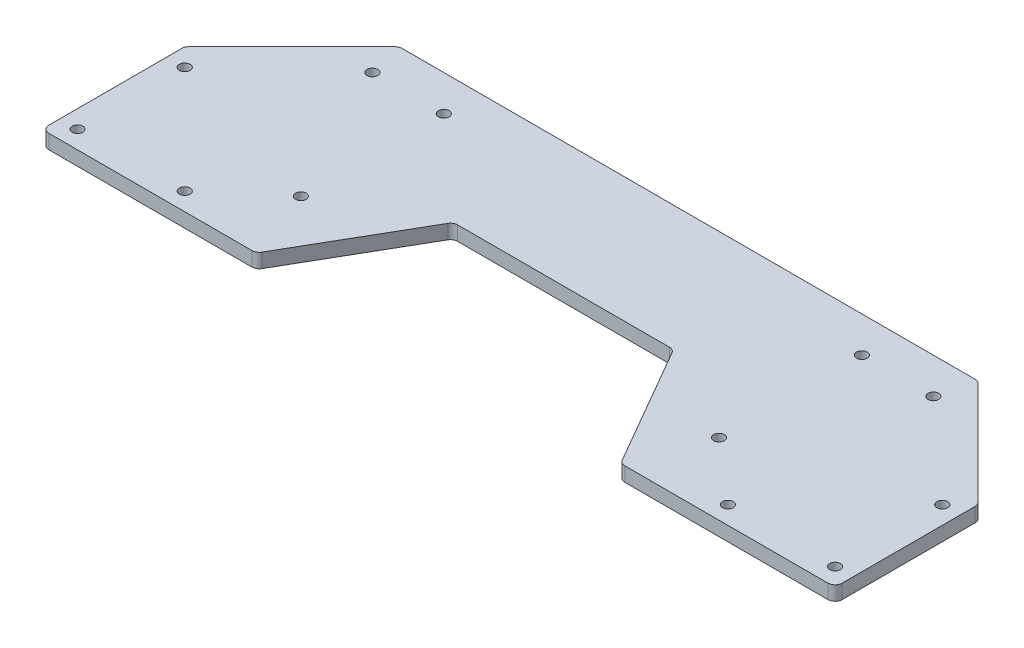
ISO-10303-21;
HEADER;
FILE_DESCRIPTION(('STEP AP214'),'2;1');
FILE_NAME('part.step','',(''),(''),'','','');
FILE_SCHEMA(('AUTOMOTIVE_DESIGN { 1 0 10303 214 1 1 1 1 }'));
ENDSEC;
DATA;
#1=APPLICATION_CONTEXT('core data for automotive mechanical design processes');
#2=APPLICATION_PROTOCOL_DEFINITION('international standard','automotive_design',2000,#1);
#3=PRODUCT_CONTEXT('',#1,'mechanical');
#4=PRODUCT('Part','Part','',(#3));
#5=PRODUCT_RELATED_PRODUCT_CATEGORY('part','',(#4));
#6=PRODUCT_DEFINITION_FORMATION('','',#4);
#7=PRODUCT_DEFINITION_CONTEXT('part definition',#1,'design');
#8=PRODUCT_DEFINITION('design','',#6,#7);
#9=PRODUCT_DEFINITION_SHAPE('','',#8);
#10=(LENGTH_UNIT() NAMED_UNIT(*) SI_UNIT(.MILLI.,.METRE.));
#11=(NAMED_UNIT(*) PLANE_ANGLE_UNIT() SI_UNIT($,.RADIAN.));
#12=(NAMED_UNIT(*) SI_UNIT($,.STERADIAN.) SOLID_ANGLE_UNIT());
#13=UNCERTAINTY_MEASURE_WITH_UNIT(LENGTH_MEASURE(1.E-05),#10,'distance_accuracy_value','');
#14=(GEOMETRIC_REPRESENTATION_CONTEXT(3) GLOBAL_UNCERTAINTY_ASSIGNED_CONTEXT((#13)) GLOBAL_UNIT_ASSIGNED_CONTEXT((#10,
#11,#12)) REPRESENTATION_CONTEXT('',''));
#15=CARTESIAN_POINT('',(0.,0.,0.));
#16=DIRECTION('',(0.,0.,1.));
#17=DIRECTION('',(1.,0.,0.));
#18=AXIS2_PLACEMENT_3D('',#15,#16,#17);
#19=CARTESIAN_POINT('',(-50.2072594216367,4.,-35.));
#20=DIRECTION('',(0.707106781186547,0.,0.707106781186549));
#21=DIRECTION('',(0.707106781186549,0.,-0.707106781186547));
#22=AXIS2_PLACEMENT_3D('',#19,#20,#21);
#23=PLANE('',#22);
#24=DIRECTION('',(-0.707106781186549,0.,0.707106781186547));
#25=VECTOR('',#24,1.);
#26=CARTESIAN_POINT('',(-50.2072594216367,4.,-35.));
#27=LINE('',#26,#25);
#28=CARTESIAN_POINT('',(-50.7930458592636,4.,-34.4142135623731));
#29=VERTEX_POINT('',#28);
#30=CARTESIAN_POINT('',(-79.6214729840099,4.,-5.58578643762689));
#31=VERTEX_POINT('',#30);
#32=EDGE_CURVE('E220',#29,#31,#27,.T.);
#33=ORIENTED_EDGE('',*,*,#32,.F.);
#34=DIRECTION('',(0.,-1.,0.));
#35=VECTOR('',#34,1.);
#36=CARTESIAN_POINT('',(-50.7930458592636,4.,-34.4142135623731));
#37=LINE('',#36,#35);
#38=CARTESIAN_POINT('',(-50.7930458592636,0.,-34.4142135623731));
#39=VERTEX_POINT('',#38);
#40=EDGE_CURVE('E322',#29,#39,#37,.T.);
#41=ORIENTED_EDGE('',*,*,#40,.T.);
#42=DIRECTION('',(-0.707106781186549,0.,0.707106781186547));
#43=VECTOR('',#42,1.);
#44=CARTESIAN_POINT('',(-50.2072594216367,0.,-35.));
#45=LINE('',#44,#43);
#46=CARTESIAN_POINT('',(-79.6214729840099,0.,-5.58578643762689));
#47=VERTEX_POINT('',#46);
#48=EDGE_CURVE('E224',#39,#47,#45,.T.);
#49=ORIENTED_EDGE('',*,*,#48,.T.);
#50=DIRECTION('',(0.,-1.,0.));
#51=VECTOR('',#50,1.);
#52=CARTESIAN_POINT('',(-79.6214729840099,4.,-5.58578643762689));
#53=LINE('',#52,#51);
#54=EDGE_CURVE('E320',#47,#31,#53,.F.);
#55=ORIENTED_EDGE('',*,*,#54,.T.);
#56=EDGE_LOOP('',(#33,#41,#49,#55));
#57=FACE_BOUND('',#56,.T.);
#58=ADVANCED_FACE('F35',(#57),#23,.F.);
#59=CARTESIAN_POINT('',(-80.2072594216368,4.,-4.99999999999998));
#60=DIRECTION('',(1.,0.,0.));
#61=DIRECTION('',(0.,0.,-1.));
#62=AXIS2_PLACEMENT_3D('',#59,#60,#61);
#63=PLANE('',#62);
#64=DIRECTION('',(0.,0.,1.));
#65=VECTOR('',#64,1.);
#66=CARTESIAN_POINT('',(-80.2072594216368,4.,-4.99999999999998));
#67=LINE('',#66,#65);
#68=CARTESIAN_POINT('',(-80.2072594216368,4.,-4.1715728752538));
#69=VERTEX_POINT('',#68);
#70=CARTESIAN_POINT('',(-80.2072594216368,4.,33.));
#71=VERTEX_POINT('',#70);
#72=EDGE_CURVE('E348',#69,#71,#67,.T.);
#73=ORIENTED_EDGE('',*,*,#72,.F.);
#74=DIRECTION('',(0.,-1.,0.));
#75=VECTOR('',#74,1.);
#76=CARTESIAN_POINT('',(-80.2072594216368,4.,-4.1715728752538));
#77=LINE('',#76,#75);
#78=CARTESIAN_POINT('',(-80.2072594216368,0.,-4.1715728752538));
#79=VERTEX_POINT('',#78);
#80=EDGE_CURVE('E327',#69,#79,#77,.T.);
#81=ORIENTED_EDGE('',*,*,#80,.T.);
#82=DIRECTION('',(0.,0.,1.));
#83=VECTOR('',#82,1.);
#84=CARTESIAN_POINT('',(-80.2072594216368,0.,-4.99999999999998));
#85=LINE('',#84,#83);
#86=CARTESIAN_POINT('',(-80.2072594216368,0.,33.));
#87=VERTEX_POINT('',#86);
#88=EDGE_CURVE('E364',#79,#87,#85,.T.);
#89=ORIENTED_EDGE('',*,*,#88,.T.);
#90=DIRECTION('',(0.,-1.,0.));
#91=VECTOR('',#90,1.);
#92=CARTESIAN_POINT('',(-80.2072594216368,4.,33.));
#93=LINE('',#92,#91);
#94=EDGE_CURVE('E325',#87,#71,#93,.F.);
#95=ORIENTED_EDGE('',*,*,#94,.T.);
#96=EDGE_LOOP('',(#73,#81,#89,#95));
#97=FACE_BOUND('',#96,.T.);
#98=ADVANCED_FACE('F383',(#97),#63,.F.);
#99=CARTESIAN_POINT('',(-80.2072594216368,4.,35.));
#100=DIRECTION('',(0.,0.,-1.));
#101=DIRECTION('',(-1.,0.,0.));
#102=AXIS2_PLACEMENT_3D('',#99,#100,#101);
#103=PLANE('',#102);
#104=DIRECTION('',(1.,0.,0.));
#105=VECTOR('',#104,1.);
#106=CARTESIAN_POINT('',(-80.2072594216368,4.,35.));
#107=LINE('',#106,#105);
#108=CARTESIAN_POINT('',(-78.2072594216368,4.,35.));
#109=VERTEX_POINT('',#108);
#110=CARTESIAN_POINT('',(-21.361959960016,4.,35.));
#111=VERTEX_POINT('',#110);
#112=EDGE_CURVE('E344',#109,#111,#107,.T.);
#113=ORIENTED_EDGE('',*,*,#112,.F.);
#114=DIRECTION('',(0.,-1.,0.));
#115=VECTOR('',#114,1.);
#116=CARTESIAN_POINT('',(-78.2072594216368,4.,35.));
#117=LINE('',#116,#115);
#118=CARTESIAN_POINT('',(-78.2072594216368,0.,35.));
#119=VERTEX_POINT('',#118);
#120=EDGE_CURVE('E184',#109,#119,#117,.T.);
#121=ORIENTED_EDGE('',*,*,#120,.T.);
#122=DIRECTION('',(1.,0.,0.));
#123=VECTOR('',#122,1.);
#124=CARTESIAN_POINT('',(-80.2072594216368,0.,35.));
#125=LINE('',#124,#123);
#126=CARTESIAN_POINT('',(-21.361959960016,0.,35.));
#127=VERTEX_POINT('',#126);
#128=EDGE_CURVE('E206',#119,#127,#125,.T.);
#129=ORIENTED_EDGE('',*,*,#128,.T.);
#130=DIRECTION('',(0.,-1.,0.));
#131=VECTOR('',#130,1.);
#132=CARTESIAN_POINT('',(-21.361959960016,4.,35.));
#133=LINE('',#132,#131);
#134=EDGE_CURVE('E330',#127,#111,#133,.F.);
#135=ORIENTED_EDGE('',*,*,#134,.T.);
#136=EDGE_LOOP('',(#113,#121,#129,#135));
#137=FACE_BOUND('',#136,.T.);
#138=ADVANCED_FACE('F371',(#137),#103,.F.);
#139=CARTESIAN_POINT('',(-20.2072594216368,4.,35.));
#140=DIRECTION('',(-0.86602540378444,0.,-0.499999999999998));
#141=DIRECTION('',(-0.499999999999998,0.,0.86602540378444));
#142=AXIS2_PLACEMENT_3D('',#139,#140,#141);
#143=PLANE('',#142);
#144=DIRECTION('',(0.499999999999998,0.,-0.86602540378444));
#145=VECTOR('',#144,1.);
#146=CARTESIAN_POINT('',(-20.2072594216368,0.,35.));
#147=LINE('',#146,#145);
#148=CARTESIAN_POINT('',(-19.6299091524472,0.,34.));
#149=VERTEX_POINT('',#148);
#150=CARTESIAN_POINT('',(-0.57735026918963,0.,1.00000000000001));
#151=VERTEX_POINT('',#150);
#152=EDGE_CURVE('E201',#149,#151,#147,.T.);
#153=ORIENTED_EDGE('',*,*,#152,.T.);
#154=DIRECTION('',(0.,-1.,0.));
#155=VECTOR('',#154,1.);
#156=CARTESIAN_POINT('',(-0.577350269189628,4.,1.00000000000001));
#157=LINE('',#156,#155);
#158=CARTESIAN_POINT('',(-0.57735026918963,4.,1.00000000000001));
#159=VERTEX_POINT('',#158);
#160=EDGE_CURVE('E178',#151,#159,#157,.F.);
#161=ORIENTED_EDGE('',*,*,#160,.T.);
#162=DIRECTION('',(0.499999999999998,0.,-0.86602540378444));
#163=VECTOR('',#162,1.);
#164=CARTESIAN_POINT('',(-20.2072594216368,4.,35.));
#165=LINE('',#164,#163);
#166=CARTESIAN_POINT('',(-19.6299091524472,4.,34.));
#167=VERTEX_POINT('',#166);
#168=EDGE_CURVE('E339',#167,#159,#165,.T.);
#169=ORIENTED_EDGE('',*,*,#168,.F.);
#170=DIRECTION('',(0.,-1.,0.));
#171=VECTOR('',#170,1.);
#172=CARTESIAN_POINT('',(-19.6299091524472,4.,34.));
#173=LINE('',#172,#171);
#174=EDGE_CURVE('E194',#167,#149,#173,.T.);
#175=ORIENTED_EDGE('',*,*,#174,.T.);
#176=EDGE_LOOP('',(#153,#161,#169,#175));
#177=FACE_BOUND('',#176,.T.);
#178=ADVANCED_FACE('F374',(#177),#143,.F.);
#179=CARTESIAN_POINT('',(0.,4.,0.));
#180=DIRECTION('',(0.,0.,-1.));
#181=DIRECTION('',(-1.,0.,0.));
#182=AXIS2_PLACEMENT_3D('',#179,#180,#181);
#183=PLANE('',#182);
#184=DIRECTION('',(1.,0.,0.));
#185=VECTOR('',#184,1.);
#186=CARTESIAN_POINT('',(0.,4.,0.));
#187=LINE('',#186,#185);
#188=CARTESIAN_POINT('',(1.15470053837925,4.,0.));
#189=VERTEX_POINT('',#188);
#190=CARTESIAN_POINT('',(60.4307806183472,4.,0.));
#191=VERTEX_POINT('',#190);
#192=EDGE_CURVE('E193',#189,#191,#187,.T.);
#193=ORIENTED_EDGE('',*,*,#192,.F.);
#194=DIRECTION('',(0.,-1.,0.));
#195=VECTOR('',#194,1.);
#196=CARTESIAN_POINT('',(1.15470053837925,0.,0.));
#197=LINE('',#196,#195);
#198=CARTESIAN_POINT('',(1.15470053837925,0.,0.));
#199=VERTEX_POINT('',#198);
#200=EDGE_CURVE('E177',#189,#199,#197,.T.);
#201=ORIENTED_EDGE('',*,*,#200,.T.);
#202=DIRECTION('',(1.,0.,0.));
#203=VECTOR('',#202,1.);
#204=CARTESIAN_POINT('',(0.,0.,0.));
#205=LINE('',#204,#203);
#206=CARTESIAN_POINT('',(60.4307806183472,0.,0.));
#207=VERTEX_POINT('',#206);
#208=EDGE_CURVE('E190',#199,#207,#205,.T.);
#209=ORIENTED_EDGE('',*,*,#208,.T.);
#210=DIRECTION('',(0.,-1.,0.));
#211=VECTOR('',#210,1.);
#212=CARTESIAN_POINT('',(60.4307806183472,4.,0.));
#213=LINE('',#212,#211);
#214=EDGE_CURVE('E195',#207,#191,#213,.F.);
#215=ORIENTED_EDGE('',*,*,#214,.T.);
#216=EDGE_LOOP('',(#193,#201,#209,#215));
#217=FACE_BOUND('',#216,.T.);
#218=ADVANCED_FACE('F189',(#217),#183,.F.);
#219=CARTESIAN_POINT('',(61.5854811567264,4.,0.));
#220=DIRECTION('',(0.86602540378444,0.,-0.499999999999998));
#221=DIRECTION('',(-0.499999999999998,0.,-0.86602540378444));
#222=AXIS2_PLACEMENT_3D('',#219,#220,#221);
#223=PLANE('',#222);
#224=DIRECTION('',(0.499999999999998,0.,0.86602540378444));
#225=VECTOR('',#224,1.);
#226=CARTESIAN_POINT('',(61.5854811567264,4.,0.));
#227=LINE('',#226,#225);
#228=CARTESIAN_POINT('',(62.162831425916,4.,1.00000000000001));
#229=VERTEX_POINT('',#228);
#230=CARTESIAN_POINT('',(81.2153903091736,4.,34.));
#231=VERTEX_POINT('',#230);
#232=EDGE_CURVE('E346',#229,#231,#227,.T.);
#233=ORIENTED_EDGE('',*,*,#232,.F.);
#234=DIRECTION('',(0.,-1.,0.));
#235=VECTOR('',#234,1.);
#236=CARTESIAN_POINT('',(62.162831425916,0.,1.00000000000001));
#237=LINE('',#236,#235);
#238=CARTESIAN_POINT('',(62.162831425916,0.,1.00000000000001));
#239=VERTEX_POINT('',#238);
#240=EDGE_CURVE('E267',#229,#239,#237,.T.);
#241=ORIENTED_EDGE('',*,*,#240,.T.);
#242=DIRECTION('',(0.499999999999998,0.,0.86602540378444));
#243=VECTOR('',#242,1.);
#244=CARTESIAN_POINT('',(61.5854811567264,0.,0.));
#245=LINE('',#244,#243);
#246=CARTESIAN_POINT('',(81.2153903091736,0.,34.));
#247=VERTEX_POINT('',#246);
#248=EDGE_CURVE('E200',#239,#247,#245,.T.);
#249=ORIENTED_EDGE('',*,*,#248,.T.);
#250=DIRECTION('',(0.,-1.,0.));
#251=VECTOR('',#250,1.);
#252=CARTESIAN_POINT('',(81.2153903091736,4.,34.));
#253=LINE('',#252,#251);
#254=EDGE_CURVE('E265',#247,#231,#253,.F.);
#255=ORIENTED_EDGE('',*,*,#254,.T.);
#256=EDGE_LOOP('',(#233,#241,#249,#255));
#257=FACE_BOUND('',#256,.T.);
#258=ADVANCED_FACE('F381',(#257),#223,.F.);
#259=CARTESIAN_POINT('',(81.7927405783632,4.,35.));
#260=DIRECTION('',(0.,0.,-1.));
#261=DIRECTION('',(-1.,0.,0.));
#262=AXIS2_PLACEMENT_3D('',#259,#260,#261);
#263=PLANE('',#262);
#264=DIRECTION('',(1.,0.,0.));
#265=VECTOR('',#264,1.);
#266=CARTESIAN_POINT('',(81.7927405783632,4.,35.));
#267=LINE('',#266,#265);
#268=CARTESIAN_POINT('',(82.9474411167425,4.,35.));
#269=VERTEX_POINT('',#268);
#270=CARTESIAN_POINT('',(139.792740578363,4.,35.));
#271=VERTEX_POINT('',#270);
#272=EDGE_CURVE('E353',#269,#271,#267,.T.);
#273=ORIENTED_EDGE('',*,*,#272,.F.);
#274=DIRECTION('',(0.,-1.,0.));
#275=VECTOR('',#274,1.);
#276=CARTESIAN_POINT('',(82.9474411167425,4.,35.));
#277=LINE('',#276,#275);
#278=CARTESIAN_POINT('',(82.9474411167425,0.,35.));
#279=VERTEX_POINT('',#278);
#280=EDGE_CURVE('E272',#269,#279,#277,.T.);
#281=ORIENTED_EDGE('',*,*,#280,.T.);
#282=DIRECTION('',(1.,0.,0.));
#283=VECTOR('',#282,1.);
#284=CARTESIAN_POINT('',(81.7927405783632,0.,35.));
#285=LINE('',#284,#283);
#286=CARTESIAN_POINT('',(139.792740578363,0.,35.));
#287=VERTEX_POINT('',#286);
#288=EDGE_CURVE('E204',#279,#287,#285,.T.);
#289=ORIENTED_EDGE('',*,*,#288,.T.);
#290=DIRECTION('',(0.,-1.,0.));
#291=VECTOR('',#290,1.);
#292=CARTESIAN_POINT('',(139.792740578363,4.,35.));
#293=LINE('',#292,#291);
#294=EDGE_CURVE('E270',#287,#271,#293,.F.);
#295=ORIENTED_EDGE('',*,*,#294,.T.);
#296=EDGE_LOOP('',(#273,#281,#289,#295));
#297=FACE_BOUND('',#296,.T.);
#298=ADVANCED_FACE('F527',(#297),#263,.F.);
#299=CARTESIAN_POINT('',(141.792740578363,4.,35.));
#300=DIRECTION('',(-1.,0.,0.));
#301=DIRECTION('',(0.,0.,1.));
#302=AXIS2_PLACEMENT_3D('',#299,#300,#301);
#303=PLANE('',#302);
#304=DIRECTION('',(0.,0.,-1.));
#305=VECTOR('',#304,1.);
#306=CARTESIAN_POINT('',(141.792740578363,4.,35.));
#307=LINE('',#306,#305);
#308=CARTESIAN_POINT('',(141.792740578363,4.,33.));
#309=VERTEX_POINT('',#308);
#310=CARTESIAN_POINT('',(141.792740578363,4.,-4.17157287525382));
#311=VERTEX_POINT('',#310);
#312=EDGE_CURVE('E356',#309,#311,#307,.T.);
#313=ORIENTED_EDGE('',*,*,#312,.F.);
#314=DIRECTION('',(0.,-1.,0.));
#315=VECTOR('',#314,1.);
#316=CARTESIAN_POINT('',(141.792740578363,4.,33.));
#317=LINE('',#316,#315);
#318=CARTESIAN_POINT('',(141.792740578363,0.,33.));
#319=VERTEX_POINT('',#318);
#320=EDGE_CURVE('E308',#309,#319,#317,.T.);
#321=ORIENTED_EDGE('',*,*,#320,.T.);
#322=DIRECTION('',(0.,0.,-1.));
#323=VECTOR('',#322,1.);
#324=CARTESIAN_POINT('',(141.792740578363,0.,35.));
#325=LINE('',#324,#323);
#326=CARTESIAN_POINT('',(141.792740578363,0.,-4.17157287525382));
#327=VERTEX_POINT('',#326);
#328=EDGE_CURVE('E212',#319,#327,#325,.T.);
#329=ORIENTED_EDGE('',*,*,#328,.T.);
#330=DIRECTION('',(0.,-1.,0.));
#331=VECTOR('',#330,1.);
#332=CARTESIAN_POINT('',(141.792740578363,4.,-4.17157287525382));
#333=LINE('',#332,#331);
#334=EDGE_CURVE('E306',#327,#311,#333,.F.);
#335=ORIENTED_EDGE('',*,*,#334,.T.);
#336=EDGE_LOOP('',(#313,#321,#329,#335));
#337=FACE_BOUND('',#336,.T.);
#338=ADVANCED_FACE('F523',(#337),#303,.F.);
#339=CARTESIAN_POINT('',(141.792740578363,4.,-5.00000000000001));
#340=DIRECTION('',(-0.707106781186546,0.,0.707106781186549));
#341=DIRECTION('',(0.707106781186549,0.,0.707106781186546));
#342=AXIS2_PLACEMENT_3D('',#339,#340,#341);
#343=PLANE('',#342);
#344=DIRECTION('',(-0.707106781186549,0.,-0.707106781186546));
#345=VECTOR('',#344,1.);
#346=CARTESIAN_POINT('',(141.792740578363,4.,-5.00000000000001));
#347=LINE('',#346,#345);
#348=CARTESIAN_POINT('',(141.206954140736,4.,-5.58578643762692));
#349=VERTEX_POINT('',#348);
#350=CARTESIAN_POINT('',(112.37852701599,4.,-34.4142135623731));
#351=VERTEX_POINT('',#350);
#352=EDGE_CURVE('E359',#349,#351,#347,.T.);
#353=ORIENTED_EDGE('',*,*,#352,.F.);
#354=DIRECTION('',(0.,-1.,0.));
#355=VECTOR('',#354,1.);
#356=CARTESIAN_POINT('',(141.206954140736,4.,-5.58578643762692));
#357=LINE('',#356,#355);
#358=CARTESIAN_POINT('',(141.206954140736,0.,-5.58578643762692));
#359=VERTEX_POINT('',#358);
#360=EDGE_CURVE('E313',#349,#359,#357,.T.);
#361=ORIENTED_EDGE('',*,*,#360,.T.);
#362=DIRECTION('',(-0.707106781186549,0.,-0.707106781186546));
#363=VECTOR('',#362,1.);
#364=CARTESIAN_POINT('',(141.792740578363,0.,-5.00000000000001));
#365=LINE('',#364,#363);
#366=CARTESIAN_POINT('',(112.37852701599,0.,-34.4142135623731));
#367=VERTEX_POINT('',#366);
#368=EDGE_CURVE('E215',#359,#367,#365,.T.);
#369=ORIENTED_EDGE('',*,*,#368,.T.);
#370=DIRECTION('',(0.,-1.,0.));
#371=VECTOR('',#370,1.);
#372=CARTESIAN_POINT('',(112.37852701599,4.,-34.4142135623731));
#373=LINE('',#372,#371);
#374=EDGE_CURVE('E311',#367,#351,#373,.F.);
#375=ORIENTED_EDGE('',*,*,#374,.T.);
#376=EDGE_LOOP('',(#353,#361,#369,#375));
#377=FACE_BOUND('',#376,.T.);
#378=ADVANCED_FACE('F520',(#377),#343,.F.);
#379=CARTESIAN_POINT('',(111.792740578363,4.,-35.));
#380=DIRECTION('',(0.,0.,1.));
#381=DIRECTION('',(1.,0.,0.));
#382=AXIS2_PLACEMENT_3D('',#379,#380,#381);
#383=PLANE('',#382);
#384=DIRECTION('',(-1.,0.,0.));
#385=VECTOR('',#384,1.);
#386=CARTESIAN_POINT('',(111.792740578363,4.,-35.));
#387=LINE('',#386,#385);
#388=CARTESIAN_POINT('',(110.964313453617,4.,-35.));
#389=VERTEX_POINT('',#388);
#390=CARTESIAN_POINT('',(-49.3788322968905,4.,-35.));
#391=VERTEX_POINT('',#390);
#392=EDGE_CURVE('E260',#389,#391,#387,.T.);
#393=ORIENTED_EDGE('',*,*,#392,.F.);
#394=DIRECTION('',(0.,-1.,0.));
#395=VECTOR('',#394,1.);
#396=CARTESIAN_POINT('',(110.964313453617,4.,-35.));
#397=LINE('',#396,#395);
#398=CARTESIAN_POINT('',(110.964313453617,0.,-35.));
#399=VERTEX_POINT('',#398);
#400=EDGE_CURVE('E317',#389,#399,#397,.T.);
#401=ORIENTED_EDGE('',*,*,#400,.T.);
#402=DIRECTION('',(-1.,0.,0.));
#403=VECTOR('',#402,1.);
#404=CARTESIAN_POINT('',(111.792740578363,0.,-35.));
#405=LINE('',#404,#403);
#406=CARTESIAN_POINT('',(-49.3788322968905,0.,-35.));
#407=VERTEX_POINT('',#406);
#408=EDGE_CURVE('E218',#399,#407,#405,.T.);
#409=ORIENTED_EDGE('',*,*,#408,.T.);
#410=DIRECTION('',(0.,-1.,0.));
#411=VECTOR('',#410,1.);
#412=CARTESIAN_POINT('',(-49.3788322968905,4.,-35.));
#413=LINE('',#412,#411);
#414=EDGE_CURVE('E50',#407,#391,#413,.F.);
#415=ORIENTED_EDGE('',*,*,#414,.T.);
#416=EDGE_LOOP('',(#393,#401,#409,#415));
#417=FACE_BOUND('',#416,.T.);
#418=ADVANCED_FACE('F479',(#417),#383,.F.);
#419=CARTESIAN_POINT('',(0.,4.,0.));
#420=DIRECTION('',(0.,-1.,0.));
#421=DIRECTION('',(0.,0.,-1.));
#422=AXIS2_PLACEMENT_3D('',#419,#420,#421);
#423=PLANE('',#422);
#424=CARTESIAN_POINT('',(-47.7072594216368,4.,-25.));
#425=DIRECTION('',(0.,1.,0.));
#426=DIRECTION('',(0.,0.,1.));
#427=AXIS2_PLACEMENT_3D('',#424,#425,#426);
#428=CIRCLE('',#427,1.5);
#429=CARTESIAN_POINT('',(-47.7072594216368,4.,-23.5));
#430=VERTEX_POINT('',#429);
#431=EDGE_CURVE('E452',#430,#430,#428,.T.);
#432=ORIENTED_EDGE('',*,*,#431,.F.);
#433=EDGE_LOOP('',(#432));
#434=FACE_BOUND('',#433,.T.);
#435=CARTESIAN_POINT('',(-75.2072594216368,4.,0.));
#436=DIRECTION('',(0.,1.,0.));
#437=DIRECTION('',(0.,0.,1.));
#438=AXIS2_PLACEMENT_3D('',#435,#436,#437);
#439=CIRCLE('',#438,1.5);
#440=CARTESIAN_POINT('',(-75.2072594216368,4.,1.5));
#441=VERTEX_POINT('',#440);
#442=EDGE_CURVE('E469',#441,#441,#439,.T.);
#443=ORIENTED_EDGE('',*,*,#442,.F.);
#444=EDGE_LOOP('',(#443));
#445=FACE_BOUND('',#444,.T.);
#446=CARTESIAN_POINT('',(-45.2072594216368,4.,30.));
#447=DIRECTION('',(0.,1.,0.));
#448=DIRECTION('',(0.,0.,1.));
#449=AXIS2_PLACEMENT_3D('',#446,#447,#448);
#450=CIRCLE('',#449,1.5);
#451=CARTESIAN_POINT('',(-45.2072594216368,4.,31.5));
#452=VERTEX_POINT('',#451);
#453=EDGE_CURVE('E464',#452,#452,#450,.T.);
#454=ORIENTED_EDGE('',*,*,#453,.F.);
#455=EDGE_LOOP('',(#454));
#456=FACE_BOUND('',#455,.T.);
#457=CARTESIAN_POINT('',(-75.2072594216368,4.,30.));
#458=DIRECTION('',(0.,1.,0.));
#459=DIRECTION('',(0.,0.,1.));
#460=AXIS2_PLACEMENT_3D('',#457,#458,#459);
#461=CIRCLE('',#460,1.5);
#462=CARTESIAN_POINT('',(-75.2072594216368,4.,31.5));
#463=VERTEX_POINT('',#462);
#464=EDGE_CURVE('E461',#463,#463,#461,.T.);
#465=ORIENTED_EDGE('',*,*,#464,.F.);
#466=EDGE_LOOP('',(#465));
#467=FACE_BOUND('',#466,.T.);
#468=CARTESIAN_POINT('',(-27.7072594216368,4.,-25.));
#469=DIRECTION('',(0.,1.,0.));
#470=DIRECTION('',(0.,0.,1.));
#471=AXIS2_PLACEMENT_3D('',#468,#469,#470);
#472=CIRCLE('',#471,1.5);
#473=CARTESIAN_POINT('',(-27.7072594216368,4.,-23.5));
#474=VERTEX_POINT('',#473);
#475=EDGE_CURVE('E230',#474,#474,#472,.T.);
#476=ORIENTED_EDGE('',*,*,#475,.F.);
#477=EDGE_LOOP('',(#476));
#478=FACE_BOUND('',#477,.T.);
#479=CARTESIAN_POINT('',(89.2927405783632,4.,15.));
#480=DIRECTION('',(0.,1.,0.));
#481=DIRECTION('',(0.,0.,-1.));
#482=AXIS2_PLACEMENT_3D('',#479,#480,#481);
#483=CIRCLE('',#482,1.50000000000001);
#484=CARTESIAN_POINT('',(89.2927405783632,4.,13.5));
#485=VERTEX_POINT('',#484);
#486=EDGE_CURVE('E453',#485,#485,#483,.T.);
#487=ORIENTED_EDGE('',*,*,#486,.F.);
#488=EDGE_LOOP('',(#487));
#489=FACE_BOUND('',#488,.T.);
#490=CARTESIAN_POINT('',(89.2927405783632,4.,-25.));
#491=DIRECTION('',(0.,1.,0.));
#492=DIRECTION('',(0.,0.,-1.));
#493=AXIS2_PLACEMENT_3D('',#490,#491,#492);
#494=CIRCLE('',#493,1.50000000000001);
#495=CARTESIAN_POINT('',(89.2927405783632,4.,-26.5));
#496=VERTEX_POINT('',#495);
#497=EDGE_CURVE('E456',#496,#496,#494,.T.);
#498=ORIENTED_EDGE('',*,*,#497,.F.);
#499=EDGE_LOOP('',(#498));
#500=FACE_BOUND('',#499,.T.);
#501=CARTESIAN_POINT('',(136.792740578363,4.,30.));
#502=DIRECTION('',(0.,1.,0.));
#503=DIRECTION('',(0.,0.,-1.));
#504=AXIS2_PLACEMENT_3D('',#501,#502,#503);
#505=CIRCLE('',#504,1.49999999999997);
#506=CARTESIAN_POINT('',(136.792740578363,4.,28.5));
#507=VERTEX_POINT('',#506);
#508=EDGE_CURVE('E446',#507,#507,#505,.T.);
#509=ORIENTED_EDGE('',*,*,#508,.F.);
#510=EDGE_LOOP('',(#509));
#511=FACE_BOUND('',#510,.T.);
#512=CARTESIAN_POINT('',(106.792740578363,4.,30.));
#513=DIRECTION('',(0.,1.,0.));
#514=DIRECTION('',(0.,0.,-1.));
#515=AXIS2_PLACEMENT_3D('',#512,#513,#514);
#516=CIRCLE('',#515,1.49999999999998);
#517=CARTESIAN_POINT('',(106.792740578363,4.,28.5));
#518=VERTEX_POINT('',#517);
#519=EDGE_CURVE('E442',#518,#518,#516,.T.);
#520=ORIENTED_EDGE('',*,*,#519,.F.);
#521=EDGE_LOOP('',(#520));
#522=FACE_BOUND('',#521,.T.);
#523=CARTESIAN_POINT('',(136.792740578363,4.,0.));
#524=DIRECTION('',(0.,1.,0.));
#525=DIRECTION('',(0.,0.,-1.));
#526=AXIS2_PLACEMENT_3D('',#523,#524,#525);
#527=CIRCLE('',#526,1.49999999999997);
#528=CARTESIAN_POINT('',(136.792740578363,4.,-1.49999999999997));
#529=VERTEX_POINT('',#528);
#530=EDGE_CURVE('E445',#529,#529,#527,.T.);
#531=ORIENTED_EDGE('',*,*,#530,.F.);
#532=EDGE_LOOP('',(#531));
#533=FACE_BOUND('',#532,.T.);
#534=CARTESIAN_POINT('',(109.292740578363,4.,-25.));
#535=DIRECTION('',(0.,1.,0.));
#536=DIRECTION('',(0.,0.,-1.));
#537=AXIS2_PLACEMENT_3D('',#534,#535,#536);
#538=CIRCLE('',#537,1.49999999999998);
#539=CARTESIAN_POINT('',(109.292740578363,4.,-26.5));
#540=VERTEX_POINT('',#539);
#541=EDGE_CURVE('E449',#540,#540,#538,.T.);
#542=ORIENTED_EDGE('',*,*,#541,.F.);
#543=EDGE_LOOP('',(#542));
#544=FACE_BOUND('',#543,.T.);
#545=CARTESIAN_POINT('',(-27.7072594216368,4.,15.));
#546=DIRECTION('',(0.,1.,0.));
#547=DIRECTION('',(0.,0.,1.));
#548=AXIS2_PLACEMENT_3D('',#545,#546,#547);
#549=CIRCLE('',#548,1.5);
#550=CARTESIAN_POINT('',(-27.7072594216368,4.,16.5));
#551=VERTEX_POINT('',#550);
#552=EDGE_CURVE('E225',#551,#551,#549,.T.);
#553=ORIENTED_EDGE('',*,*,#552,.F.);
#554=EDGE_LOOP('',(#553));
#555=FACE_BOUND('',#554,.T.);
#556=ORIENTED_EDGE('',*,*,#232,.T.);
#557=CARTESIAN_POINT('',(82.9474411167425,4.,33.));
#558=DIRECTION('',(0.,-1.,0.));
#559=DIRECTION('',(0.,0.,-1.));
#560=AXIS2_PLACEMENT_3D('',#557,#558,#559);
#561=CIRCLE('',#560,2.);
#562=EDGE_CURVE('E304',#231,#269,#561,.F.);
#563=ORIENTED_EDGE('',*,*,#562,.T.);
#564=ORIENTED_EDGE('',*,*,#272,.T.);
#565=CARTESIAN_POINT('',(139.792740578363,4.,33.));
#566=DIRECTION('',(0.,-1.,0.));
#567=DIRECTION('',(0.,0.,-1.));
#568=AXIS2_PLACEMENT_3D('',#565,#566,#567);
#569=CIRCLE('',#568,2.);
#570=EDGE_CURVE('E302',#271,#309,#569,.F.);
#571=ORIENTED_EDGE('',*,*,#570,.T.);
#572=ORIENTED_EDGE('',*,*,#312,.T.);
#573=CARTESIAN_POINT('',(139.792740578363,4.,-4.17157287525382));
#574=DIRECTION('',(0.,-1.,0.));
#575=DIRECTION('',(0.,0.,-1.));
#576=AXIS2_PLACEMENT_3D('',#573,#574,#575);
#577=CIRCLE('',#576,2.);
#578=EDGE_CURVE('E300',#311,#349,#577,.F.);
#579=ORIENTED_EDGE('',*,*,#578,.T.);
#580=ORIENTED_EDGE('',*,*,#352,.T.);
#581=CARTESIAN_POINT('',(110.964313453617,4.,-33.));
#582=DIRECTION('',(0.,-1.,0.));
#583=DIRECTION('',(0.,0.,-1.));
#584=AXIS2_PLACEMENT_3D('',#581,#582,#583);
#585=CIRCLE('',#584,2.);
#586=EDGE_CURVE('E57',#351,#389,#585,.F.);
#587=ORIENTED_EDGE('',*,*,#586,.T.);
#588=ORIENTED_EDGE('',*,*,#392,.T.);
#589=CARTESIAN_POINT('',(-49.3788322968905,4.,-33.));
#590=DIRECTION('',(0.,-1.,0.));
#591=DIRECTION('',(0.,0.,-1.));
#592=AXIS2_PLACEMENT_3D('',#589,#590,#591);
#593=CIRCLE('',#592,2.);
#594=EDGE_CURVE('E297',#391,#29,#593,.F.);
#595=ORIENTED_EDGE('',*,*,#594,.T.);
#596=ORIENTED_EDGE('',*,*,#32,.T.);
#597=CARTESIAN_POINT('',(-78.2072594216368,4.,-4.1715728752538));
#598=DIRECTION('',(0.,-1.,0.));
#599=DIRECTION('',(0.,0.,-1.));
#600=AXIS2_PLACEMENT_3D('',#597,#598,#599);
#601=CIRCLE('',#600,2.);
#602=EDGE_CURVE('E295',#31,#69,#601,.F.);
#603=ORIENTED_EDGE('',*,*,#602,.T.);
#604=ORIENTED_EDGE('',*,*,#72,.T.);
#605=CARTESIAN_POINT('',(-78.2072594216368,4.,33.));
#606=DIRECTION('',(0.,-1.,0.));
#607=DIRECTION('',(0.,0.,-1.));
#608=AXIS2_PLACEMENT_3D('',#605,#606,#607);
#609=CIRCLE('',#608,2.);
#610=EDGE_CURVE('E293',#71,#109,#609,.F.);
#611=ORIENTED_EDGE('',*,*,#610,.T.);
#612=ORIENTED_EDGE('',*,*,#112,.T.);
#613=CARTESIAN_POINT('',(-21.361959960016,4.,33.));
#614=DIRECTION('',(0.,-1.,0.));
#615=DIRECTION('',(0.,0.,-1.));
#616=AXIS2_PLACEMENT_3D('',#613,#614,#615);
#617=CIRCLE('',#616,2.);
#618=EDGE_CURVE('E291',#111,#167,#617,.F.);
#619=ORIENTED_EDGE('',*,*,#618,.T.);
#620=ORIENTED_EDGE('',*,*,#168,.T.);
#621=CARTESIAN_POINT('',(1.15470053837925,4.,2.));
#622=DIRECTION('',(0.,-1.,0.));
#623=DIRECTION('',(0.,0.,-1.));
#624=AXIS2_PLACEMENT_3D('',#621,#622,#623);
#625=CIRCLE('',#624,2.);
#626=EDGE_CURVE('E183',#159,#189,#625,.T.);
#627=ORIENTED_EDGE('',*,*,#626,.T.);
#628=ORIENTED_EDGE('',*,*,#192,.T.);
#629=CARTESIAN_POINT('',(60.4307806183472,4.,2.));
#630=DIRECTION('',(0.,-1.,0.));
#631=DIRECTION('',(0.,0.,-1.));
#632=AXIS2_PLACEMENT_3D('',#629,#630,#631);
#633=CIRCLE('',#632,2.);
#634=EDGE_CURVE('E11',#191,#229,#633,.T.);
#635=ORIENTED_EDGE('',*,*,#634,.T.);
#636=EDGE_LOOP('',(#556,#563,#564,#571,#572,#579,#580,#587,#588,#595,#596,#603,#604,#611,#612,
#619,#620,#627,#628,#635));
#637=FACE_BOUND('',#636,.T.);
#638=ADVANCED_FACE('F336',(#434,#445,#456,#467,#478,#489,#500,#511,#522,#533,#544,#555,#637),
#423,.F.);
#639=CARTESIAN_POINT('',(0.,0.,0.));
#640=DIRECTION('',(0.,-1.,0.));
#641=DIRECTION('',(0.,0.,-1.));
#642=AXIS2_PLACEMENT_3D('',#639,#640,#641);
#643=PLANE('',#642);
#644=CARTESIAN_POINT('',(-47.7072594216368,0.,-25.));
#645=DIRECTION('',(0.,-1.,0.));
#646=DIRECTION('',(0.,0.,-1.));
#647=AXIS2_PLACEMENT_3D('',#644,#645,#646);
#648=CIRCLE('',#647,1.5);
#649=CARTESIAN_POINT('',(-47.7072594216368,0.,-26.5));
#650=VERTEX_POINT('',#649);
#651=EDGE_CURVE('E257',#650,#650,#648,.T.);
#652=ORIENTED_EDGE('',*,*,#651,.F.);
#653=EDGE_LOOP('',(#652));
#654=FACE_BOUND('',#653,.T.);
#655=CARTESIAN_POINT('',(-75.2072594216368,0.,0.));
#656=DIRECTION('',(0.,-1.,0.));
#657=DIRECTION('',(0.,0.,-1.));
#658=AXIS2_PLACEMENT_3D('',#655,#656,#657);
#659=CIRCLE('',#658,1.5);
#660=CARTESIAN_POINT('',(-75.2072594216368,0.,-1.49999999999999));
#661=VERTEX_POINT('',#660);
#662=EDGE_CURVE('E254',#661,#661,#659,.T.);
#663=ORIENTED_EDGE('',*,*,#662,.F.);
#664=EDGE_LOOP('',(#663));
#665=FACE_BOUND('',#664,.T.);
#666=CARTESIAN_POINT('',(-45.2072594216368,0.,30.));
#667=DIRECTION('',(0.,-1.,0.));
#668=DIRECTION('',(0.,0.,-1.));
#669=AXIS2_PLACEMENT_3D('',#666,#667,#668);
#670=CIRCLE('',#669,1.5);
#671=CARTESIAN_POINT('',(-45.2072594216368,0.,28.5));
#672=VERTEX_POINT('',#671);
#673=EDGE_CURVE('E251',#672,#672,#670,.T.);
#674=ORIENTED_EDGE('',*,*,#673,.F.);
#675=EDGE_LOOP('',(#674));
#676=FACE_BOUND('',#675,.T.);
#677=CARTESIAN_POINT('',(-75.2072594216368,0.,30.));
#678=DIRECTION('',(0.,-1.,0.));
#679=DIRECTION('',(0.,0.,-1.));
#680=AXIS2_PLACEMENT_3D('',#677,#678,#679);
#681=CIRCLE('',#680,1.5);
#682=CARTESIAN_POINT('',(-75.2072594216368,0.,28.5));
#683=VERTEX_POINT('',#682);
#684=EDGE_CURVE('E248',#683,#683,#681,.T.);
#685=ORIENTED_EDGE('',*,*,#684,.F.);
#686=EDGE_LOOP('',(#685));
#687=FACE_BOUND('',#686,.T.);
#688=CARTESIAN_POINT('',(-27.7072594216368,0.,-25.));
#689=DIRECTION('',(0.,-1.,0.));
#690=DIRECTION('',(0.,0.,-1.));
#691=AXIS2_PLACEMENT_3D('',#688,#689,#690);
#692=CIRCLE('',#691,1.5);
#693=CARTESIAN_POINT('',(-27.7072594216368,0.,-26.5));
#694=VERTEX_POINT('',#693);
#695=EDGE_CURVE('E245',#694,#694,#692,.T.);
#696=ORIENTED_EDGE('',*,*,#695,.F.);
#697=EDGE_LOOP('',(#696));
#698=FACE_BOUND('',#697,.T.);
#699=CARTESIAN_POINT('',(89.2927405783632,0.,15.));
#700=DIRECTION('',(0.,-1.,0.));
#701=DIRECTION('',(0.,0.,-1.));
#702=AXIS2_PLACEMENT_3D('',#699,#700,#701);
#703=CIRCLE('',#702,1.50000000000001);
#704=CARTESIAN_POINT('',(89.2927405783632,0.,13.5));
#705=VERTEX_POINT('',#704);
#706=EDGE_CURVE('E242',#705,#705,#703,.T.);
#707=ORIENTED_EDGE('',*,*,#706,.F.);
#708=EDGE_LOOP('',(#707));
#709=FACE_BOUND('',#708,.T.);
#710=CARTESIAN_POINT('',(89.2927405783632,0.,-25.));
#711=DIRECTION('',(0.,-1.,0.));
#712=DIRECTION('',(0.,0.,-1.));
#713=AXIS2_PLACEMENT_3D('',#710,#711,#712);
#714=CIRCLE('',#713,1.50000000000001);
#715=CARTESIAN_POINT('',(89.2927405783632,0.,-26.5));
#716=VERTEX_POINT('',#715);
#717=EDGE_CURVE('E239',#716,#716,#714,.T.);
#718=ORIENTED_EDGE('',*,*,#717,.F.);
#719=EDGE_LOOP('',(#718));
#720=FACE_BOUND('',#719,.T.);
#721=CARTESIAN_POINT('',(136.792740578363,0.,30.));
#722=DIRECTION('',(0.,-1.,0.));
#723=DIRECTION('',(0.,0.,-1.));
#724=AXIS2_PLACEMENT_3D('',#721,#722,#723);
#725=CIRCLE('',#724,1.49999999999997);
#726=CARTESIAN_POINT('',(136.792740578363,0.,28.5));
#727=VERTEX_POINT('',#726);
#728=EDGE_CURVE('E236',#727,#727,#725,.T.);
#729=ORIENTED_EDGE('',*,*,#728,.F.);
#730=EDGE_LOOP('',(#729));
#731=FACE_BOUND('',#730,.T.);
#732=CARTESIAN_POINT('',(106.792740578363,0.,30.));
#733=DIRECTION('',(0.,-1.,0.));
#734=DIRECTION('',(0.,0.,-1.));
#735=AXIS2_PLACEMENT_3D('',#732,#733,#734);
#736=CIRCLE('',#735,1.49999999999998);
#737=CARTESIAN_POINT('',(106.792740578363,0.,28.5));
#738=VERTEX_POINT('',#737);
#739=EDGE_CURVE('E233',#738,#738,#736,.T.);
#740=ORIENTED_EDGE('',*,*,#739,.F.);
#741=EDGE_LOOP('',(#740));
#742=FACE_BOUND('',#741,.T.);
#743=CARTESIAN_POINT('',(136.792740578363,0.,0.));
#744=DIRECTION('',(0.,-1.,0.));
#745=DIRECTION('',(0.,0.,-1.));
#746=AXIS2_PLACEMENT_3D('',#743,#744,#745);
#747=CIRCLE('',#746,1.49999999999997);
#748=CARTESIAN_POINT('',(136.792740578363,0.,-1.49999999999997));
#749=VERTEX_POINT('',#748);
#750=EDGE_CURVE('E229',#749,#749,#747,.T.);
#751=ORIENTED_EDGE('',*,*,#750,.F.);
#752=EDGE_LOOP('',(#751));
#753=FACE_BOUND('',#752,.T.);
#754=CARTESIAN_POINT('',(109.292740578363,0.,-25.));
#755=DIRECTION('',(0.,-1.,0.));
#756=DIRECTION('',(0.,0.,-1.));
#757=AXIS2_PLACEMENT_3D('',#754,#755,#756);
#758=CIRCLE('',#757,1.49999999999998);
#759=CARTESIAN_POINT('',(109.292740578363,0.,-26.5));
#760=VERTEX_POINT('',#759);
#761=EDGE_CURVE('E226',#760,#760,#758,.T.);
#762=ORIENTED_EDGE('',*,*,#761,.F.);
#763=EDGE_LOOP('',(#762));
#764=FACE_BOUND('',#763,.T.);
#765=CARTESIAN_POINT('',(-27.7072594216368,0.,15.));
#766=DIRECTION('',(0.,-1.,0.));
#767=DIRECTION('',(0.,0.,-1.));
#768=AXIS2_PLACEMENT_3D('',#765,#766,#767);
#769=CIRCLE('',#768,1.5);
#770=CARTESIAN_POINT('',(-27.7072594216368,0.,13.5));
#771=VERTEX_POINT('',#770);
#772=EDGE_CURVE('E221',#771,#771,#769,.T.);
#773=ORIENTED_EDGE('',*,*,#772,.F.);
#774=EDGE_LOOP('',(#773));
#775=FACE_BOUND('',#774,.T.);
#776=ORIENTED_EDGE('',*,*,#288,.F.);
#777=CARTESIAN_POINT('',(82.9474411167425,0.,33.));
#778=DIRECTION('',(0.,-1.,0.));
#779=DIRECTION('',(0.,0.,-1.));
#780=AXIS2_PLACEMENT_3D('',#777,#778,#779);
#781=CIRCLE('',#780,2.);
#782=EDGE_CURVE('E289',#279,#247,#781,.T.);
#783=ORIENTED_EDGE('',*,*,#782,.T.);
#784=ORIENTED_EDGE('',*,*,#248,.F.);
#785=CARTESIAN_POINT('',(60.4307806183472,0.,2.));
#786=DIRECTION('',(0.,-1.,0.));
#787=DIRECTION('',(0.,0.,-1.));
#788=AXIS2_PLACEMENT_3D('',#785,#786,#787);
#789=CIRCLE('',#788,2.);
#790=EDGE_CURVE('E43',#239,#207,#789,.F.);
#791=ORIENTED_EDGE('',*,*,#790,.T.);
#792=ORIENTED_EDGE('',*,*,#208,.F.);
#793=CARTESIAN_POINT('',(1.15470053837925,0.,2.));
#794=DIRECTION('',(0.,-1.,0.));
#795=DIRECTION('',(0.,0.,-1.));
#796=AXIS2_PLACEMENT_3D('',#793,#794,#795);
#797=CIRCLE('',#796,2.);
#798=EDGE_CURVE('E173',#199,#151,#797,.F.);
#799=ORIENTED_EDGE('',*,*,#798,.T.);
#800=ORIENTED_EDGE('',*,*,#152,.F.);
#801=CARTESIAN_POINT('',(-21.361959960016,0.,33.));
#802=DIRECTION('',(0.,-1.,0.));
#803=DIRECTION('',(0.,0.,-1.));
#804=AXIS2_PLACEMENT_3D('',#801,#802,#803);
#805=CIRCLE('',#804,2.);
#806=EDGE_CURVE('E275',#149,#127,#805,.T.);
#807=ORIENTED_EDGE('',*,*,#806,.T.);
#808=ORIENTED_EDGE('',*,*,#128,.F.);
#809=CARTESIAN_POINT('',(-78.2072594216368,0.,33.));
#810=DIRECTION('',(0.,-1.,0.));
#811=DIRECTION('',(0.,0.,-1.));
#812=AXIS2_PLACEMENT_3D('',#809,#810,#811);
#813=CIRCLE('',#812,2.);
#814=EDGE_CURVE('E277',#119,#87,#813,.T.);
#815=ORIENTED_EDGE('',*,*,#814,.T.);
#816=ORIENTED_EDGE('',*,*,#88,.F.);
#817=CARTESIAN_POINT('',(-78.2072594216368,0.,-4.1715728752538));
#818=DIRECTION('',(0.,-1.,0.));
#819=DIRECTION('',(0.,0.,-1.));
#820=AXIS2_PLACEMENT_3D('',#817,#818,#819);
#821=CIRCLE('',#820,2.);
#822=EDGE_CURVE('E279',#79,#47,#821,.T.);
#823=ORIENTED_EDGE('',*,*,#822,.T.);
#824=ORIENTED_EDGE('',*,*,#48,.F.);
#825=CARTESIAN_POINT('',(-49.3788322968905,0.,-33.));
#826=DIRECTION('',(0.,-1.,0.));
#827=DIRECTION('',(0.,0.,-1.));
#828=AXIS2_PLACEMENT_3D('',#825,#826,#827);
#829=CIRCLE('',#828,2.);
#830=EDGE_CURVE('E281',#39,#407,#829,.T.);
#831=ORIENTED_EDGE('',*,*,#830,.T.);
#832=ORIENTED_EDGE('',*,*,#408,.F.);
#833=CARTESIAN_POINT('',(110.964313453617,0.,-33.));
#834=DIRECTION('',(0.,-1.,0.));
#835=DIRECTION('',(0.,0.,-1.));
#836=AXIS2_PLACEMENT_3D('',#833,#834,#835);
#837=CIRCLE('',#836,2.);
#838=EDGE_CURVE('E283',#399,#367,#837,.T.);
#839=ORIENTED_EDGE('',*,*,#838,.T.);
#840=ORIENTED_EDGE('',*,*,#368,.F.);
#841=CARTESIAN_POINT('',(139.792740578363,0.,-4.17157287525382));
#842=DIRECTION('',(0.,-1.,0.));
#843=DIRECTION('',(0.,0.,-1.));
#844=AXIS2_PLACEMENT_3D('',#841,#842,#843);
#845=CIRCLE('',#844,2.);
#846=EDGE_CURVE('E285',#359,#327,#845,.T.);
#847=ORIENTED_EDGE('',*,*,#846,.T.);
#848=ORIENTED_EDGE('',*,*,#328,.F.);
#849=CARTESIAN_POINT('',(139.792740578363,0.,33.));
#850=DIRECTION('',(0.,-1.,0.));
#851=DIRECTION('',(0.,0.,-1.));
#852=AXIS2_PLACEMENT_3D('',#849,#850,#851);
#853=CIRCLE('',#852,2.);
#854=EDGE_CURVE('E287',#319,#287,#853,.T.);
#855=ORIENTED_EDGE('',*,*,#854,.T.);
#856=EDGE_LOOP('',(#776,#783,#784,#791,#792,#799,#800,#807,#808,#815,#816,#823,#824,#831,#832,
#839,#840,#847,#848,#855));
#857=FACE_BOUND('',#856,.T.);
#858=ADVANCED_FACE('F198',(#654,#665,#676,#687,#698,#709,#720,#731,#742,#753,#764,#775,#857),
#643,.T.);
#859=CARTESIAN_POINT('',(-27.7072594216368,-6.,15.));
#860=DIRECTION('',(0.,1.,0.));
#861=DIRECTION('',(0.,0.,1.));
#862=AXIS2_PLACEMENT_3D('',#859,#860,#861);
#863=CYLINDRICAL_SURFACE('',#862,1.5);
#864=ORIENTED_EDGE('',*,*,#772,.T.);
#865=EDGE_LOOP('',(#864));
#866=FACE_BOUND('',#865,.T.);
#867=ORIENTED_EDGE('',*,*,#552,.T.);
#868=EDGE_LOOP('',(#867));
#869=FACE_BOUND('',#868,.T.);
#870=ADVANCED_FACE('F500',(#866,#869),#863,.F.);
#871=CARTESIAN_POINT('',(109.292740578363,-6.,-25.));
#872=DIRECTION('',(0.,1.,0.));
#873=DIRECTION('',(0.,0.,1.));
#874=AXIS2_PLACEMENT_3D('',#871,#872,#873);
#875=CYLINDRICAL_SURFACE('',#874,1.49999999999998);
#876=ORIENTED_EDGE('',*,*,#761,.T.);
#877=EDGE_LOOP('',(#876));
#878=FACE_BOUND('',#877,.T.);
#879=ORIENTED_EDGE('',*,*,#541,.T.);
#880=EDGE_LOOP('',(#879));
#881=FACE_BOUND('',#880,.T.);
#882=ADVANCED_FACE('F502',(#878,#881),#875,.F.);
#883=CARTESIAN_POINT('',(136.792740578363,-6.,0.));
#884=DIRECTION('',(0.,1.,0.));
#885=DIRECTION('',(0.,0.,1.));
#886=AXIS2_PLACEMENT_3D('',#883,#884,#885);
#887=CYLINDRICAL_SURFACE('',#886,1.49999999999997);
#888=ORIENTED_EDGE('',*,*,#750,.T.);
#889=EDGE_LOOP('',(#888));
#890=FACE_BOUND('',#889,.T.);
#891=ORIENTED_EDGE('',*,*,#530,.T.);
#892=EDGE_LOOP('',(#891));
#893=FACE_BOUND('',#892,.T.);
#894=ADVANCED_FACE('F509',(#890,#893),#887,.F.);
#895=CARTESIAN_POINT('',(106.792740578363,-6.,30.));
#896=DIRECTION('',(0.,1.,0.));
#897=DIRECTION('',(0.,0.,1.));
#898=AXIS2_PLACEMENT_3D('',#895,#896,#897);
#899=CYLINDRICAL_SURFACE('',#898,1.49999999999998);
#900=ORIENTED_EDGE('',*,*,#739,.T.);
#901=EDGE_LOOP('',(#900));
#902=FACE_BOUND('',#901,.T.);
#903=ORIENTED_EDGE('',*,*,#519,.T.);
#904=EDGE_LOOP('',(#903));
#905=FACE_BOUND('',#904,.T.);
#906=ADVANCED_FACE('F515',(#902,#905),#899,.F.);
#907=CARTESIAN_POINT('',(136.792740578363,-6.,30.));
#908=DIRECTION('',(0.,1.,0.));
#909=DIRECTION('',(0.,0.,1.));
#910=AXIS2_PLACEMENT_3D('',#907,#908,#909);
#911=CYLINDRICAL_SURFACE('',#910,1.49999999999997);
#912=ORIENTED_EDGE('',*,*,#728,.T.);
#913=EDGE_LOOP('',(#912));
#914=FACE_BOUND('',#913,.T.);
#915=ORIENTED_EDGE('',*,*,#508,.T.);
#916=EDGE_LOOP('',(#915));
#917=FACE_BOUND('',#916,.T.);
#918=ADVANCED_FACE('F700',(#914,#917),#911,.F.);
#919=CARTESIAN_POINT('',(89.2927405783632,-6.,-25.));
#920=DIRECTION('',(0.,1.,0.));
#921=DIRECTION('',(0.,0.,1.));
#922=AXIS2_PLACEMENT_3D('',#919,#920,#921);
#923=CYLINDRICAL_SURFACE('',#922,1.50000000000001);
#924=ORIENTED_EDGE('',*,*,#717,.T.);
#925=EDGE_LOOP('',(#924));
#926=FACE_BOUND('',#925,.T.);
#927=ORIENTED_EDGE('',*,*,#497,.T.);
#928=EDGE_LOOP('',(#927));
#929=FACE_BOUND('',#928,.T.);
#930=ADVANCED_FACE('F692',(#926,#929),#923,.F.);
#931=CARTESIAN_POINT('',(89.2927405783632,-6.,15.));
#932=DIRECTION('',(0.,1.,0.));
#933=DIRECTION('',(0.,0.,1.));
#934=AXIS2_PLACEMENT_3D('',#931,#932,#933);
#935=CYLINDRICAL_SURFACE('',#934,1.50000000000001);
#936=ORIENTED_EDGE('',*,*,#706,.T.);
#937=EDGE_LOOP('',(#936));
#938=FACE_BOUND('',#937,.T.);
#939=ORIENTED_EDGE('',*,*,#486,.T.);
#940=EDGE_LOOP('',(#939));
#941=FACE_BOUND('',#940,.T.);
#942=ADVANCED_FACE('F684',(#938,#941),#935,.F.);
#943=CARTESIAN_POINT('',(-27.7072594216368,-6.,-25.));
#944=DIRECTION('',(0.,1.,0.));
#945=DIRECTION('',(0.,0.,1.));
#946=AXIS2_PLACEMENT_3D('',#943,#944,#945);
#947=CYLINDRICAL_SURFACE('',#946,1.5);
#948=ORIENTED_EDGE('',*,*,#695,.T.);
#949=EDGE_LOOP('',(#948));
#950=FACE_BOUND('',#949,.T.);
#951=ORIENTED_EDGE('',*,*,#475,.T.);
#952=EDGE_LOOP('',(#951));
#953=FACE_BOUND('',#952,.T.);
#954=ADVANCED_FACE('F676',(#950,#953),#947,.F.);
#955=CARTESIAN_POINT('',(-75.2072594216368,-6.,30.));
#956=DIRECTION('',(0.,1.,0.));
#957=DIRECTION('',(0.,0.,1.));
#958=AXIS2_PLACEMENT_3D('',#955,#956,#957);
#959=CYLINDRICAL_SURFACE('',#958,1.5);
#960=ORIENTED_EDGE('',*,*,#684,.T.);
#961=EDGE_LOOP('',(#960));
#962=FACE_BOUND('',#961,.T.);
#963=ORIENTED_EDGE('',*,*,#464,.T.);
#964=EDGE_LOOP('',(#963));
#965=FACE_BOUND('',#964,.T.);
#966=ADVANCED_FACE('F668',(#962,#965),#959,.F.);
#967=CARTESIAN_POINT('',(-45.2072594216368,-6.,30.));
#968=DIRECTION('',(0.,1.,0.));
#969=DIRECTION('',(0.,0.,1.));
#970=AXIS2_PLACEMENT_3D('',#967,#968,#969);
#971=CYLINDRICAL_SURFACE('',#970,1.5);
#972=ORIENTED_EDGE('',*,*,#673,.T.);
#973=EDGE_LOOP('',(#972));
#974=FACE_BOUND('',#973,.T.);
#975=ORIENTED_EDGE('',*,*,#453,.T.);
#976=EDGE_LOOP('',(#975));
#977=FACE_BOUND('',#976,.T.);
#978=ADVANCED_FACE('F475',(#974,#977),#971,.F.);
#979=CARTESIAN_POINT('',(-75.2072594216368,-6.,0.));
#980=DIRECTION('',(0.,1.,0.));
#981=DIRECTION('',(0.,0.,1.));
#982=AXIS2_PLACEMENT_3D('',#979,#980,#981);
#983=CYLINDRICAL_SURFACE('',#982,1.5);
#984=ORIENTED_EDGE('',*,*,#662,.T.);
#985=EDGE_LOOP('',(#984));
#986=FACE_BOUND('',#985,.T.);
#987=ORIENTED_EDGE('',*,*,#442,.T.);
#988=EDGE_LOOP('',(#987));
#989=FACE_BOUND('',#988,.T.);
#990=ADVANCED_FACE('F654',(#986,#989),#983,.F.);
#991=CARTESIAN_POINT('',(-47.7072594216368,-6.,-25.));
#992=DIRECTION('',(0.,1.,0.));
#993=DIRECTION('',(0.,0.,1.));
#994=AXIS2_PLACEMENT_3D('',#991,#992,#993);
#995=CYLINDRICAL_SURFACE('',#994,1.5);
#996=ORIENTED_EDGE('',*,*,#651,.T.);
#997=EDGE_LOOP('',(#996));
#998=FACE_BOUND('',#997,.T.);
#999=ORIENTED_EDGE('',*,*,#431,.T.);
#1000=EDGE_LOOP('',(#999));
#1001=FACE_BOUND('',#1000,.T.);
#1002=ADVANCED_FACE('F398',(#998,#1001),#995,.F.);
#1003=CARTESIAN_POINT('',(1.15470053837925,4.,2.));
#1004=DIRECTION('',(0.,1.,0.));
#1005=DIRECTION('',(0.,0.,1.));
#1006=AXIS2_PLACEMENT_3D('',#1003,#1004,#1005);
#1007=CYLINDRICAL_SURFACE('',#1006,2.);
#1008=ORIENTED_EDGE('',*,*,#626,.F.);
#1009=ORIENTED_EDGE('',*,*,#160,.F.);
#1010=ORIENTED_EDGE('',*,*,#798,.F.);
#1011=ORIENTED_EDGE('',*,*,#200,.F.);
#1012=EDGE_LOOP('',(#1008,#1009,#1010,#1011));
#1013=FACE_BOUND('',#1012,.T.);
#1014=ADVANCED_FACE('F176',(#1013),#1007,.F.);
#1015=CARTESIAN_POINT('',(60.4307806183472,4.,2.));
#1016=DIRECTION('',(0.,1.,0.));
#1017=DIRECTION('',(0.,0.,1.));
#1018=AXIS2_PLACEMENT_3D('',#1015,#1016,#1017);
#1019=CYLINDRICAL_SURFACE('',#1018,2.);
#1020=ORIENTED_EDGE('',*,*,#634,.F.);
#1021=ORIENTED_EDGE('',*,*,#214,.F.);
#1022=ORIENTED_EDGE('',*,*,#790,.F.);
#1023=ORIENTED_EDGE('',*,*,#240,.F.);
#1024=EDGE_LOOP('',(#1020,#1021,#1022,#1023));
#1025=FACE_BOUND('',#1024,.T.);
#1026=ADVANCED_FACE('F397',(#1025),#1019,.F.);
#1027=CARTESIAN_POINT('',(82.9474411167425,4.,33.));
#1028=DIRECTION('',(0.,-1.,0.));
#1029=DIRECTION('',(0.,0.,-1.));
#1030=AXIS2_PLACEMENT_3D('',#1027,#1028,#1029);
#1031=CYLINDRICAL_SURFACE('',#1030,2.);
#1032=ORIENTED_EDGE('',*,*,#562,.F.);
#1033=ORIENTED_EDGE('',*,*,#254,.F.);
#1034=ORIENTED_EDGE('',*,*,#782,.F.);
#1035=ORIENTED_EDGE('',*,*,#280,.F.);
#1036=EDGE_LOOP('',(#1032,#1033,#1034,#1035));
#1037=FACE_BOUND('',#1036,.T.);
#1038=ADVANCED_FACE('F401',(#1037),#1031,.T.);
#1039=CARTESIAN_POINT('',(139.792740578363,4.,33.));
#1040=DIRECTION('',(0.,-1.,0.));
#1041=DIRECTION('',(0.,0.,-1.));
#1042=AXIS2_PLACEMENT_3D('',#1039,#1040,#1041);
#1043=CYLINDRICAL_SURFACE('',#1042,2.);
#1044=ORIENTED_EDGE('',*,*,#570,.F.);
#1045=ORIENTED_EDGE('',*,*,#294,.F.);
#1046=ORIENTED_EDGE('',*,*,#854,.F.);
#1047=ORIENTED_EDGE('',*,*,#320,.F.);
#1048=EDGE_LOOP('',(#1044,#1045,#1046,#1047));
#1049=FACE_BOUND('',#1048,.T.);
#1050=ADVANCED_FACE('F405',(#1049),#1043,.T.);
#1051=CARTESIAN_POINT('',(139.792740578363,4.,-4.17157287525382));
#1052=DIRECTION('',(0.,-1.,0.));
#1053=DIRECTION('',(0.,0.,-1.));
#1054=AXIS2_PLACEMENT_3D('',#1051,#1052,#1053);
#1055=CYLINDRICAL_SURFACE('',#1054,2.);
#1056=ORIENTED_EDGE('',*,*,#578,.F.);
#1057=ORIENTED_EDGE('',*,*,#334,.F.);
#1058=ORIENTED_EDGE('',*,*,#846,.F.);
#1059=ORIENTED_EDGE('',*,*,#360,.F.);
#1060=EDGE_LOOP('',(#1056,#1057,#1058,#1059));
#1061=FACE_BOUND('',#1060,.T.);
#1062=ADVANCED_FACE('F409',(#1061),#1055,.T.);
#1063=CARTESIAN_POINT('',(110.964313453617,4.,-33.));
#1064=DIRECTION('',(0.,-1.,0.));
#1065=DIRECTION('',(0.,0.,-1.));
#1066=AXIS2_PLACEMENT_3D('',#1063,#1064,#1065);
#1067=CYLINDRICAL_SURFACE('',#1066,2.);
#1068=ORIENTED_EDGE('',*,*,#586,.F.);
#1069=ORIENTED_EDGE('',*,*,#374,.F.);
#1070=ORIENTED_EDGE('',*,*,#838,.F.);
#1071=ORIENTED_EDGE('',*,*,#400,.F.);
#1072=EDGE_LOOP('',(#1068,#1069,#1070,#1071));
#1073=FACE_BOUND('',#1072,.T.);
#1074=ADVANCED_FACE('F413',(#1073),#1067,.T.);
#1075=CARTESIAN_POINT('',(-49.3788322968905,4.,-33.));
#1076=DIRECTION('',(0.,-1.,0.));
#1077=DIRECTION('',(0.,0.,-1.));
#1078=AXIS2_PLACEMENT_3D('',#1075,#1076,#1077);
#1079=CYLINDRICAL_SURFACE('',#1078,2.);
#1080=ORIENTED_EDGE('',*,*,#594,.F.);
#1081=ORIENTED_EDGE('',*,*,#414,.F.);
#1082=ORIENTED_EDGE('',*,*,#830,.F.);
#1083=ORIENTED_EDGE('',*,*,#40,.F.);
#1084=EDGE_LOOP('',(#1080,#1081,#1082,#1083));
#1085=FACE_BOUND('',#1084,.T.);
#1086=ADVANCED_FACE('F417',(#1085),#1079,.T.);
#1087=CARTESIAN_POINT('',(-78.2072594216368,4.,-4.1715728752538));
#1088=DIRECTION('',(0.,-1.,0.));
#1089=DIRECTION('',(0.,0.,-1.));
#1090=AXIS2_PLACEMENT_3D('',#1087,#1088,#1089);
#1091=CYLINDRICAL_SURFACE('',#1090,2.);
#1092=ORIENTED_EDGE('',*,*,#602,.F.);
#1093=ORIENTED_EDGE('',*,*,#54,.F.);
#1094=ORIENTED_EDGE('',*,*,#822,.F.);
#1095=ORIENTED_EDGE('',*,*,#80,.F.);
#1096=EDGE_LOOP('',(#1092,#1093,#1094,#1095));
#1097=FACE_BOUND('',#1096,.T.);
#1098=ADVANCED_FACE('F421',(#1097),#1091,.T.);
#1099=CARTESIAN_POINT('',(-78.2072594216368,4.,33.));
#1100=DIRECTION('',(0.,-1.,0.));
#1101=DIRECTION('',(0.,0.,-1.));
#1102=AXIS2_PLACEMENT_3D('',#1099,#1100,#1101);
#1103=CYLINDRICAL_SURFACE('',#1102,2.);
#1104=ORIENTED_EDGE('',*,*,#610,.F.);
#1105=ORIENTED_EDGE('',*,*,#94,.F.);
#1106=ORIENTED_EDGE('',*,*,#814,.F.);
#1107=ORIENTED_EDGE('',*,*,#120,.F.);
#1108=EDGE_LOOP('',(#1104,#1105,#1106,#1107));
#1109=FACE_BOUND('',#1108,.T.);
#1110=ADVANCED_FACE('F424',(#1109),#1103,.T.);
#1111=CARTESIAN_POINT('',(-21.361959960016,4.,33.));
#1112=DIRECTION('',(0.,-1.,0.));
#1113=DIRECTION('',(0.,0.,-1.));
#1114=AXIS2_PLACEMENT_3D('',#1111,#1112,#1113);
#1115=CYLINDRICAL_SURFACE('',#1114,2.);
#1116=ORIENTED_EDGE('',*,*,#618,.F.);
#1117=ORIENTED_EDGE('',*,*,#134,.F.);
#1118=ORIENTED_EDGE('',*,*,#806,.F.);
#1119=ORIENTED_EDGE('',*,*,#174,.F.);
#1120=EDGE_LOOP('',(#1116,#1117,#1118,#1119));
#1121=FACE_BOUND('',#1120,.T.);
#1122=ADVANCED_FACE('F37',(#1121),#1115,.T.);
#1123=CLOSED_SHELL('',(#58,#98,#138,#178,#218,#258,#298,#338,#378,#418,#638,#858,#870,#882,#894,
#906,#918,#930,#942,#954,#966,#978,#990,#1002,#1014,#1026,#1038,#1050,#1062,#1074,#1086,#1098,
#1110,#1122));
#1124=MANIFOLD_SOLID_BREP('B2',#1123);
#1125=ADVANCED_BREP_SHAPE_REPRESENTATION('',(#18,#1124),#14);
#1126=SHAPE_DEFINITION_REPRESENTATION(#9,#1125);
ENDSEC;
END-ISO-10303-21;
